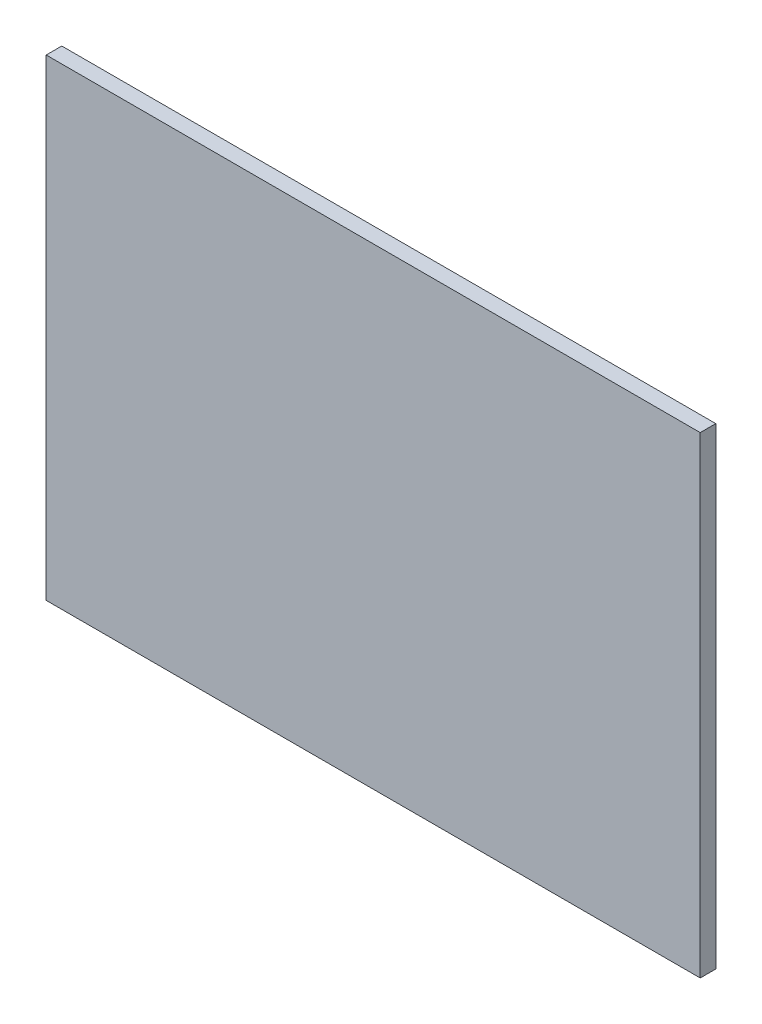
ISO-10303-21;
HEADER;
FILE_DESCRIPTION(('STEP AP214'),'2;1');
FILE_NAME('part.step','',(''),(''),'','','');
FILE_SCHEMA(('AUTOMOTIVE_DESIGN { 1 0 10303 214 1 1 1 1 }'));
ENDSEC;
DATA;
#1=APPLICATION_CONTEXT('core data for automotive mechanical design processes');
#2=APPLICATION_PROTOCOL_DEFINITION('international standard','automotive_design',2000,#1);
#3=PRODUCT_CONTEXT('',#1,'mechanical');
#4=PRODUCT('Part','Part','',(#3));
#5=PRODUCT_RELATED_PRODUCT_CATEGORY('part','',(#4));
#6=PRODUCT_DEFINITION_FORMATION('','',#4);
#7=PRODUCT_DEFINITION_CONTEXT('part definition',#1,'design');
#8=PRODUCT_DEFINITION('design','',#6,#7);
#9=PRODUCT_DEFINITION_SHAPE('','',#8);
#10=(LENGTH_UNIT() NAMED_UNIT(*) SI_UNIT(.MILLI.,.METRE.));
#11=(NAMED_UNIT(*) PLANE_ANGLE_UNIT() SI_UNIT($,.RADIAN.));
#12=(NAMED_UNIT(*) SI_UNIT($,.STERADIAN.) SOLID_ANGLE_UNIT());
#13=UNCERTAINTY_MEASURE_WITH_UNIT(LENGTH_MEASURE(1.E-05),#10,'distance_accuracy_value','');
#14=(GEOMETRIC_REPRESENTATION_CONTEXT(3) GLOBAL_UNCERTAINTY_ASSIGNED_CONTEXT((#13)) GLOBAL_UNIT_ASSIGNED_CONTEXT((#10,
#11,#12)) REPRESENTATION_CONTEXT('',''));
#15=CARTESIAN_POINT('',(0.,0.,0.));
#16=DIRECTION('',(0.,0.,1.));
#17=DIRECTION('',(1.,0.,0.));
#18=AXIS2_PLACEMENT_3D('',#15,#16,#17);
#19=CARTESIAN_POINT('',(-63.,45.5,3.));
#20=DIRECTION('',(1.,0.,0.));
#21=DIRECTION('',(0.,0.,-1.));
#22=AXIS2_PLACEMENT_3D('',#19,#20,#21);
#23=PLANE('',#22);
#24=DIRECTION('',(0.,-1.,0.));
#25=VECTOR('',#24,1.);
#26=CARTESIAN_POINT('',(-63.,45.5,0.));
#27=LINE('',#26,#25);
#28=CARTESIAN_POINT('',(-63.,45.5,0.));
#29=VERTEX_POINT('',#28);
#30=CARTESIAN_POINT('',(-63.,-45.5,0.));
#31=VERTEX_POINT('',#30);
#32=EDGE_CURVE('E98',#29,#31,#27,.T.);
#33=ORIENTED_EDGE('',*,*,#32,.T.);
#34=DIRECTION('',(0.,0.,-1.));
#35=VECTOR('',#34,1.);
#36=CARTESIAN_POINT('',(-63.,-45.5,3.));
#37=LINE('',#36,#35);
#38=CARTESIAN_POINT('',(-63.,-45.5,3.));
#39=VERTEX_POINT('',#38);
#40=EDGE_CURVE('E11',#39,#31,#37,.T.);
#41=ORIENTED_EDGE('',*,*,#40,.F.);
#42=DIRECTION('',(0.,-1.,0.));
#43=VECTOR('',#42,1.);
#44=CARTESIAN_POINT('',(-63.,45.5,3.));
#45=LINE('',#44,#43);
#46=CARTESIAN_POINT('',(-63.,45.5,3.));
#47=VERTEX_POINT('',#46);
#48=EDGE_CURVE('E86',#47,#39,#45,.T.);
#49=ORIENTED_EDGE('',*,*,#48,.F.);
#50=DIRECTION('',(0.,0.,-1.));
#51=VECTOR('',#50,1.);
#52=CARTESIAN_POINT('',(-63.,45.5,3.));
#53=LINE('',#52,#51);
#54=EDGE_CURVE('E94',#47,#29,#53,.T.);
#55=ORIENTED_EDGE('',*,*,#54,.T.);
#56=EDGE_LOOP('',(#33,#41,#49,#55));
#57=FACE_BOUND('',#56,.T.);
#58=ADVANCED_FACE('F35',(#57),#23,.F.);
#59=CARTESIAN_POINT('',(-63.,-45.5,3.));
#60=DIRECTION('',(0.,1.,0.));
#61=DIRECTION('',(-1.,0.,0.));
#62=AXIS2_PLACEMENT_3D('',#59,#60,#61);
#63=PLANE('',#62);
#64=DIRECTION('',(1.,0.,0.));
#65=VECTOR('',#64,1.);
#66=CARTESIAN_POINT('',(-63.,-45.5,0.));
#67=LINE('',#66,#65);
#68=CARTESIAN_POINT('',(63.,-45.5,0.));
#69=VERTEX_POINT('',#68);
#70=EDGE_CURVE('E90',#31,#69,#67,.T.);
#71=ORIENTED_EDGE('',*,*,#70,.T.);
#72=DIRECTION('',(0.,0.,-1.));
#73=VECTOR('',#72,1.);
#74=CARTESIAN_POINT('',(63.,-45.5,3.));
#75=LINE('',#74,#73);
#76=CARTESIAN_POINT('',(63.,-45.5,3.));
#77=VERTEX_POINT('',#76);
#78=EDGE_CURVE('E43',#77,#69,#75,.T.);
#79=ORIENTED_EDGE('',*,*,#78,.F.);
#80=DIRECTION('',(1.,0.,0.));
#81=VECTOR('',#80,1.);
#82=CARTESIAN_POINT('',(-63.,-45.5,3.));
#83=LINE('',#82,#81);
#84=EDGE_CURVE('E81',#39,#77,#83,.T.);
#85=ORIENTED_EDGE('',*,*,#84,.F.);
#86=ORIENTED_EDGE('',*,*,#40,.T.);
#87=EDGE_LOOP('',(#71,#79,#85,#86));
#88=FACE_BOUND('',#87,.T.);
#89=ADVANCED_FACE('F89',(#88),#63,.F.);
#90=CARTESIAN_POINT('',(63.,45.5,3.));
#91=DIRECTION('',(-1.,0.,0.));
#92=DIRECTION('',(0.,-1.,0.));
#93=AXIS2_PLACEMENT_3D('',#90,#91,#92);
#94=PLANE('',#93);
#95=DIRECTION('',(0.,1.,0.));
#96=VECTOR('',#95,1.);
#97=CARTESIAN_POINT('',(63.,45.5,0.));
#98=LINE('',#97,#96);
#99=CARTESIAN_POINT('',(63.,45.5,0.));
#100=VERTEX_POINT('',#99);
#101=EDGE_CURVE('E68',#69,#100,#98,.T.);
#102=ORIENTED_EDGE('',*,*,#101,.T.);
#103=DIRECTION('',(0.,0.,-1.));
#104=VECTOR('',#103,1.);
#105=CARTESIAN_POINT('',(63.,45.5,3.));
#106=LINE('',#105,#104);
#107=CARTESIAN_POINT('',(63.,45.5,3.));
#108=VERTEX_POINT('',#107);
#109=EDGE_CURVE('E91',#108,#100,#106,.T.);
#110=ORIENTED_EDGE('',*,*,#109,.F.);
#111=DIRECTION('',(0.,1.,0.));
#112=VECTOR('',#111,1.);
#113=CARTESIAN_POINT('',(63.,45.5,3.));
#114=LINE('',#113,#112);
#115=EDGE_CURVE('E84',#77,#108,#114,.T.);
#116=ORIENTED_EDGE('',*,*,#115,.F.);
#117=ORIENTED_EDGE('',*,*,#78,.T.);
#118=EDGE_LOOP('',(#102,#110,#116,#117));
#119=FACE_BOUND('',#118,.T.);
#120=ADVANCED_FACE('F92',(#119),#94,.F.);
#121=CARTESIAN_POINT('',(-63.,45.5,3.));
#122=DIRECTION('',(0.,-1.,0.));
#123=DIRECTION('',(0.,0.,-1.));
#124=AXIS2_PLACEMENT_3D('',#121,#122,#123);
#125=PLANE('',#124);
#126=DIRECTION('',(-1.,0.,0.));
#127=VECTOR('',#126,1.);
#128=CARTESIAN_POINT('',(-63.,45.5,0.));
#129=LINE('',#128,#127);
#130=EDGE_CURVE('E74',#100,#29,#129,.T.);
#131=ORIENTED_EDGE('',*,*,#130,.T.);
#132=ORIENTED_EDGE('',*,*,#54,.F.);
#133=DIRECTION('',(-1.,0.,0.));
#134=VECTOR('',#133,1.);
#135=CARTESIAN_POINT('',(-63.,45.5,3.));
#136=LINE('',#135,#134);
#137=EDGE_CURVE('E51',#108,#47,#136,.T.);
#138=ORIENTED_EDGE('',*,*,#137,.F.);
#139=ORIENTED_EDGE('',*,*,#109,.T.);
#140=EDGE_LOOP('',(#131,#132,#138,#139));
#141=FACE_BOUND('',#140,.T.);
#142=ADVANCED_FACE('F105',(#141),#125,.F.);
#143=CARTESIAN_POINT('',(0.,0.,3.));
#144=DIRECTION('',(0.,0.,1.));
#145=DIRECTION('',(1.,0.,0.));
#146=AXIS2_PLACEMENT_3D('',#143,#144,#145);
#147=PLANE('',#146);
#148=ORIENTED_EDGE('',*,*,#48,.T.);
#149=ORIENTED_EDGE('',*,*,#84,.T.);
#150=ORIENTED_EDGE('',*,*,#115,.T.);
#151=ORIENTED_EDGE('',*,*,#137,.T.);
#152=EDGE_LOOP('',(#148,#149,#150,#151));
#153=FACE_BOUND('',#152,.T.);
#154=ADVANCED_FACE('F82',(#153),#147,.T.);
#155=CARTESIAN_POINT('',(0.,0.,0.));
#156=DIRECTION('',(0.,0.,1.));
#157=DIRECTION('',(1.,0.,0.));
#158=AXIS2_PLACEMENT_3D('',#155,#156,#157);
#159=PLANE('',#158);
#160=ORIENTED_EDGE('',*,*,#32,.F.);
#161=ORIENTED_EDGE('',*,*,#130,.F.);
#162=ORIENTED_EDGE('',*,*,#101,.F.);
#163=ORIENTED_EDGE('',*,*,#70,.F.);
#164=EDGE_LOOP('',(#160,#161,#162,#163));
#165=FACE_BOUND('',#164,.T.);
#166=ADVANCED_FACE('F108',(#165),#159,.F.);
#167=CLOSED_SHELL('',(#58,#89,#120,#142,#154,#166));
#168=MANIFOLD_SOLID_BREP('B2',#167);
#169=ADVANCED_BREP_SHAPE_REPRESENTATION('',(#18,#168),#14);
#170=SHAPE_DEFINITION_REPRESENTATION(#9,#169);
ENDSEC;
END-ISO-10303-21;
